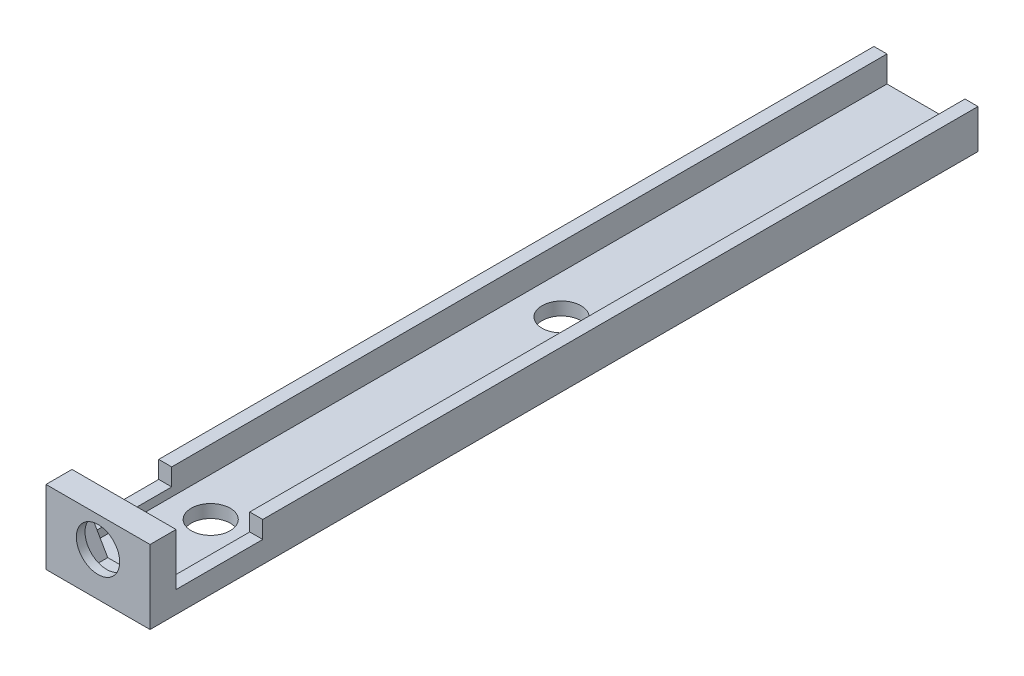
ISO-10303-21;
HEADER;
FILE_DESCRIPTION(('STEP AP214'),'2;1');
FILE_NAME('part.step','',(''),(''),'','','');
FILE_SCHEMA(('AUTOMOTIVE_DESIGN { 1 0 10303 214 1 1 1 1 }'));
ENDSEC;
DATA;
#1=APPLICATION_CONTEXT('core data for automotive mechanical design processes');
#2=APPLICATION_PROTOCOL_DEFINITION('international standard','automotive_design',2000,#1);
#3=PRODUCT_CONTEXT('',#1,'mechanical');
#4=PRODUCT('Part','Part','',(#3));
#5=PRODUCT_RELATED_PRODUCT_CATEGORY('part','',(#4));
#6=PRODUCT_DEFINITION_FORMATION('','',#4);
#7=PRODUCT_DEFINITION_CONTEXT('part definition',#1,'design');
#8=PRODUCT_DEFINITION('design','',#6,#7);
#9=PRODUCT_DEFINITION_SHAPE('','',#8);
#10=(LENGTH_UNIT() NAMED_UNIT(*) SI_UNIT(.MILLI.,.METRE.));
#11=(NAMED_UNIT(*) PLANE_ANGLE_UNIT() SI_UNIT($,.RADIAN.));
#12=(NAMED_UNIT(*) SI_UNIT($,.STERADIAN.) SOLID_ANGLE_UNIT());
#13=UNCERTAINTY_MEASURE_WITH_UNIT(LENGTH_MEASURE(1.E-05),#10,'distance_accuracy_value','');
#14=(GEOMETRIC_REPRESENTATION_CONTEXT(3) GLOBAL_UNCERTAINTY_ASSIGNED_CONTEXT((#13)) GLOBAL_UNIT_ASSIGNED_CONTEXT((#10,
#11,#12)) REPRESENTATION_CONTEXT('',''));
#15=CARTESIAN_POINT('',(0.,0.,0.));
#16=DIRECTION('',(0.,0.,1.));
#17=DIRECTION('',(1.,0.,0.));
#18=AXIS2_PLACEMENT_3D('',#15,#16,#17);
#19=CARTESIAN_POINT('',(21.,2.99999999999999,165.));
#20=DIRECTION('',(1.,0.,0.));
#21=DIRECTION('',(0.,0.,-1.));
#22=AXIS2_PLACEMENT_3D('',#19,#20,#21);
#23=PLANE('',#22);
#24=DIRECTION('',(0.,-1.,0.));
#25=VECTOR('',#24,1.);
#26=CARTESIAN_POINT('',(21.,0.,185.));
#27=LINE('',#26,#25);
#28=CARTESIAN_POINT('',(21.,4.99999999999999,185.));
#29=VERTEX_POINT('',#28);
#30=CARTESIAN_POINT('',(21.,2.99999999999999,185.));
#31=VERTEX_POINT('',#30);
#32=EDGE_CURVE('E254',#29,#31,#27,.T.);
#33=ORIENTED_EDGE('',*,*,#32,.F.);
#34=DIRECTION('',(0.,0.,-1.));
#35=VECTOR('',#34,1.);
#36=CARTESIAN_POINT('',(21.,4.99999999999999,189.));
#37=LINE('',#36,#35);
#38=CARTESIAN_POINT('',(21.,4.99999999999999,165.));
#39=VERTEX_POINT('',#38);
#40=EDGE_CURVE('E301',#29,#39,#37,.T.);
#41=ORIENTED_EDGE('',*,*,#40,.T.);
#42=DIRECTION('',(0.,-1.,0.));
#43=VECTOR('',#42,1.);
#44=CARTESIAN_POINT('',(21.,2.99999999999999,165.));
#45=LINE('',#44,#43);
#46=CARTESIAN_POINT('',(21.,8.99999999999999,165.));
#47=VERTEX_POINT('',#46);
#48=EDGE_CURVE('E310',#47,#39,#45,.T.);
#49=ORIENTED_EDGE('',*,*,#48,.F.);
#50=DIRECTION('',(0.,0.,-1.));
#51=VECTOR('',#50,1.);
#52=CARTESIAN_POINT('',(21.,8.99999999999999,165.));
#53=LINE('',#52,#51);
#54=CARTESIAN_POINT('',(21.,8.99999999999999,0.));
#55=VERTEX_POINT('',#54);
#56=EDGE_CURVE('E342',#47,#55,#53,.T.);
#57=ORIENTED_EDGE('',*,*,#56,.T.);
#58=DIRECTION('',(0.,-1.,0.));
#59=VECTOR('',#58,1.);
#60=CARTESIAN_POINT('',(21.,2.99999999999999,0.));
#61=LINE('',#60,#59);
#62=CARTESIAN_POINT('',(21.,2.99999999999999,0.));
#63=VERTEX_POINT('',#62);
#64=EDGE_CURVE('E323',#55,#63,#61,.T.);
#65=ORIENTED_EDGE('',*,*,#64,.T.);
#66=DIRECTION('',(0.,0.,-1.));
#67=VECTOR('',#66,1.);
#68=CARTESIAN_POINT('',(21.,2.99999999999999,165.));
#69=LINE('',#68,#67);
#70=EDGE_CURVE('E340',#31,#63,#69,.T.);
#71=ORIENTED_EDGE('',*,*,#70,.F.);
#72=EDGE_LOOP('',(#33,#41,#49,#57,#65,#71));
#73=FACE_BOUND('',#72,.T.);
#74=ADVANCED_FACE('F43',(#73),#23,.F.);
#75=CARTESIAN_POINT('',(3.,3.,165.));
#76=DIRECTION('',(0.,-1.,0.));
#77=DIRECTION('',(1.,0.,0.));
#78=AXIS2_PLACEMENT_3D('',#75,#76,#77);
#79=PLANE('',#78);
#80=CARTESIAN_POINT('',(12.,3.,165.));
#81=DIRECTION('',(0.,1.,0.));
#82=DIRECTION('',(-1.,0.,0.));
#83=AXIS2_PLACEMENT_3D('',#80,#81,#82);
#84=CIRCLE('',#83,4.50000000000001);
#85=CARTESIAN_POINT('',(7.49999999999999,3.,165.));
#86=VERTEX_POINT('',#85);
#87=EDGE_CURVE('E424',#86,#86,#84,.T.);
#88=ORIENTED_EDGE('',*,*,#87,.F.);
#89=EDGE_LOOP('',(#88));
#90=FACE_BOUND('',#89,.T.);
#91=CARTESIAN_POINT('',(12.,3.,84.075));
#92=DIRECTION('',(0.,1.,0.));
#93=DIRECTION('',(-1.,0.,0.));
#94=AXIS2_PLACEMENT_3D('',#91,#92,#93);
#95=CIRCLE('',#94,4.5);
#96=CARTESIAN_POINT('',(7.5,3.,84.075));
#97=VERTEX_POINT('',#96);
#98=EDGE_CURVE('E422',#97,#97,#95,.T.);
#99=ORIENTED_EDGE('',*,*,#98,.F.);
#100=EDGE_LOOP('',(#99));
#101=FACE_BOUND('',#100,.T.);
#102=DIRECTION('',(-1.,0.,0.));
#103=VECTOR('',#102,1.);
#104=CARTESIAN_POINT('',(0.,3.,185.));
#105=LINE('',#104,#103);
#106=CARTESIAN_POINT('',(3.,3.,185.));
#107=VERTEX_POINT('',#106);
#108=EDGE_CURVE('E252',#31,#107,#105,.T.);
#109=ORIENTED_EDGE('',*,*,#108,.F.);
#110=ORIENTED_EDGE('',*,*,#70,.T.);
#111=DIRECTION('',(-1.,0.,0.));
#112=VECTOR('',#111,1.);
#113=CARTESIAN_POINT('',(3.,3.,0.));
#114=LINE('',#113,#112);
#115=CARTESIAN_POINT('',(3.,3.,0.));
#116=VERTEX_POINT('',#115);
#117=EDGE_CURVE('E326',#63,#116,#114,.T.);
#118=ORIENTED_EDGE('',*,*,#117,.T.);
#119=DIRECTION('',(0.,0.,-1.));
#120=VECTOR('',#119,1.);
#121=CARTESIAN_POINT('',(3.,3.,165.));
#122=LINE('',#121,#120);
#123=EDGE_CURVE('E338',#107,#116,#122,.T.);
#124=ORIENTED_EDGE('',*,*,#123,.F.);
#125=EDGE_LOOP('',(#109,#110,#118,#124));
#126=FACE_BOUND('',#125,.T.);
#127=ADVANCED_FACE('F400',(#90,#101,#126),#79,.F.);
#128=CARTESIAN_POINT('',(3.,9.,165.));
#129=DIRECTION('',(-1.,0.,0.));
#130=DIRECTION('',(0.,-1.,0.));
#131=AXIS2_PLACEMENT_3D('',#128,#129,#130);
#132=PLANE('',#131);
#133=DIRECTION('',(0.,1.,0.));
#134=VECTOR('',#133,1.);
#135=CARTESIAN_POINT('',(3.,0.,185.));
#136=LINE('',#135,#134);
#137=CARTESIAN_POINT('',(3.,4.99999999999999,185.));
#138=VERTEX_POINT('',#137);
#139=EDGE_CURVE('E250',#107,#138,#136,.T.);
#140=ORIENTED_EDGE('',*,*,#139,.F.);
#141=ORIENTED_EDGE('',*,*,#123,.T.);
#142=DIRECTION('',(0.,1.,0.));
#143=VECTOR('',#142,1.);
#144=CARTESIAN_POINT('',(3.,9.,0.));
#145=LINE('',#144,#143);
#146=CARTESIAN_POINT('',(3.,9.,0.));
#147=VERTEX_POINT('',#146);
#148=EDGE_CURVE('E329',#116,#147,#145,.T.);
#149=ORIENTED_EDGE('',*,*,#148,.T.);
#150=DIRECTION('',(0.,0.,-1.));
#151=VECTOR('',#150,1.);
#152=CARTESIAN_POINT('',(3.,9.,165.));
#153=LINE('',#152,#151);
#154=CARTESIAN_POINT('',(3.,9.,165.));
#155=VERTEX_POINT('',#154);
#156=EDGE_CURVE('E335',#155,#147,#153,.T.);
#157=ORIENTED_EDGE('',*,*,#156,.F.);
#158=DIRECTION('',(0.,1.,0.));
#159=VECTOR('',#158,1.);
#160=CARTESIAN_POINT('',(3.,9.,165.));
#161=LINE('',#160,#159);
#162=CARTESIAN_POINT('',(3.,4.99999999999999,165.));
#163=VERTEX_POINT('',#162);
#164=EDGE_CURVE('E313',#163,#155,#161,.T.);
#165=ORIENTED_EDGE('',*,*,#164,.F.);
#166=DIRECTION('',(0.,0.,-1.));
#167=VECTOR('',#166,1.);
#168=CARTESIAN_POINT('',(3.,4.99999999999999,189.));
#169=LINE('',#168,#167);
#170=EDGE_CURVE('E66',#138,#163,#169,.T.);
#171=ORIENTED_EDGE('',*,*,#170,.F.);
#172=EDGE_LOOP('',(#140,#141,#149,#157,#165,#171));
#173=FACE_BOUND('',#172,.T.);
#174=ADVANCED_FACE('F384',(#173),#132,.F.);
#175=CARTESIAN_POINT('',(24.,4.99999999999999,189.));
#176=DIRECTION('',(0.,-1.,0.));
#177=DIRECTION('',(0.,0.,-1.));
#178=AXIS2_PLACEMENT_3D('',#175,#176,#177);
#179=PLANE('',#178);
#180=DIRECTION('',(-1.,0.,0.));
#181=VECTOR('',#180,1.);
#182=CARTESIAN_POINT('',(0.,4.99999999999999,185.));
#183=LINE('',#182,#181);
#184=CARTESIAN_POINT('',(24.,4.99999999999999,185.));
#185=VERTEX_POINT('',#184);
#186=EDGE_CURVE('E239',#185,#29,#183,.T.);
#187=ORIENTED_EDGE('',*,*,#186,.F.);
#188=DIRECTION('',(0.,0.,-1.));
#189=VECTOR('',#188,1.);
#190=CARTESIAN_POINT('',(24.,4.99999999999999,189.));
#191=LINE('',#190,#189);
#192=CARTESIAN_POINT('',(24.,4.99999999999999,165.));
#193=VERTEX_POINT('',#192);
#194=EDGE_CURVE('E303',#185,#193,#191,.T.);
#195=ORIENTED_EDGE('',*,*,#194,.T.);
#196=DIRECTION('',(-1.,0.,0.));
#197=VECTOR('',#196,1.);
#198=CARTESIAN_POINT('',(24.,4.99999999999999,165.));
#199=LINE('',#198,#197);
#200=EDGE_CURVE('E275',#193,#39,#199,.T.);
#201=ORIENTED_EDGE('',*,*,#200,.T.);
#202=ORIENTED_EDGE('',*,*,#40,.F.);
#203=EDGE_LOOP('',(#187,#195,#201,#202));
#204=FACE_BOUND('',#203,.T.);
#205=ADVANCED_FACE('F368',(#204),#179,.F.);
#206=CARTESIAN_POINT('',(3.,4.99999999999999,189.));
#207=DIRECTION('',(0.,-1.,0.));
#208=DIRECTION('',(0.,0.,-1.));
#209=AXIS2_PLACEMENT_3D('',#206,#207,#208);
#210=PLANE('',#209);
#211=DIRECTION('',(-1.,0.,0.));
#212=VECTOR('',#211,1.);
#213=CARTESIAN_POINT('',(0.,4.99999999999999,185.));
#214=LINE('',#213,#212);
#215=CARTESIAN_POINT('',(0.,4.99999999999999,185.));
#216=VERTEX_POINT('',#215);
#217=EDGE_CURVE('E248',#138,#216,#214,.T.);
#218=ORIENTED_EDGE('',*,*,#217,.F.);
#219=ORIENTED_EDGE('',*,*,#170,.T.);
#220=DIRECTION('',(-1.,0.,0.));
#221=VECTOR('',#220,1.);
#222=CARTESIAN_POINT('',(3.,4.99999999999999,165.));
#223=LINE('',#222,#221);
#224=CARTESIAN_POINT('',(0.,4.99999999999999,165.));
#225=VERTEX_POINT('',#224);
#226=EDGE_CURVE('E297',#163,#225,#223,.T.);
#227=ORIENTED_EDGE('',*,*,#226,.T.);
#228=DIRECTION('',(0.,0.,-1.));
#229=VECTOR('',#228,1.);
#230=CARTESIAN_POINT('',(0.,4.99999999999999,189.));
#231=LINE('',#230,#229);
#232=EDGE_CURVE('E58',#216,#225,#231,.T.);
#233=ORIENTED_EDGE('',*,*,#232,.F.);
#234=EDGE_LOOP('',(#218,#219,#227,#233));
#235=FACE_BOUND('',#234,.T.);
#236=ADVANCED_FACE('F377',(#235),#210,.F.);
#237=CARTESIAN_POINT('',(0.,0.,165.));
#238=DIRECTION('',(0.,0.,-1.));
#239=DIRECTION('',(-1.,0.,0.));
#240=AXIS2_PLACEMENT_3D('',#237,#238,#239);
#241=PLANE('',#240);
#242=ORIENTED_EDGE('',*,*,#226,.F.);
#243=ORIENTED_EDGE('',*,*,#164,.T.);
#244=DIRECTION('',(-1.,0.,0.));
#245=VECTOR('',#244,1.);
#246=CARTESIAN_POINT('',(0.,9.,165.));
#247=LINE('',#246,#245);
#248=CARTESIAN_POINT('',(0.,9.,165.));
#249=VERTEX_POINT('',#248);
#250=EDGE_CURVE('E315',#155,#249,#247,.T.);
#251=ORIENTED_EDGE('',*,*,#250,.T.);
#252=DIRECTION('',(0.,-1.,0.));
#253=VECTOR('',#252,1.);
#254=CARTESIAN_POINT('',(0.,0.,165.));
#255=LINE('',#254,#253);
#256=EDGE_CURVE('E197',#249,#225,#255,.T.);
#257=ORIENTED_EDGE('',*,*,#256,.T.);
#258=EDGE_LOOP('',(#242,#243,#251,#257));
#259=FACE_BOUND('',#258,.T.);
#260=ADVANCED_FACE('F380',(#259),#241,.F.);
#261=ORIENTED_EDGE('',*,*,#200,.F.);
#262=DIRECTION('',(0.,1.,0.));
#263=VECTOR('',#262,1.);
#264=CARTESIAN_POINT('',(24.,8.99999999999999,165.));
#265=LINE('',#264,#263);
#266=CARTESIAN_POINT('',(24.,8.99999999999999,165.));
#267=VERTEX_POINT('',#266);
#268=EDGE_CURVE('E306',#193,#267,#265,.T.);
#269=ORIENTED_EDGE('',*,*,#268,.T.);
#270=DIRECTION('',(-1.,0.,0.));
#271=VECTOR('',#270,1.);
#272=CARTESIAN_POINT('',(21.,8.99999999999999,165.));
#273=LINE('',#272,#271);
#274=EDGE_CURVE('E308',#267,#47,#273,.T.);
#275=ORIENTED_EDGE('',*,*,#274,.T.);
#276=ORIENTED_EDGE('',*,*,#48,.T.);
#277=EDGE_LOOP('',(#261,#269,#275,#276));
#278=FACE_BOUND('',#277,.T.);
#279=ADVANCED_FACE('F365',(#278),#241,.F.);
#280=CARTESIAN_POINT('',(24.,0.,165.));
#281=DIRECTION('',(0.,1.,0.));
#282=DIRECTION('',(-1.,0.,0.));
#283=AXIS2_PLACEMENT_3D('',#280,#281,#282);
#284=PLANE('',#283);
#285=CARTESIAN_POINT('',(12.,0.,165.));
#286=DIRECTION('',(0.,1.,0.));
#287=DIRECTION('',(-1.,0.,0.));
#288=AXIS2_PLACEMENT_3D('',#285,#286,#287);
#289=CIRCLE('',#288,4.50000000000001);
#290=CARTESIAN_POINT('',(7.49999999999999,0.,165.));
#291=VERTEX_POINT('',#290);
#292=EDGE_CURVE('E213',#291,#291,#289,.T.);
#293=ORIENTED_EDGE('',*,*,#292,.T.);
#294=EDGE_LOOP('',(#293));
#295=FACE_BOUND('',#294,.T.);
#296=CARTESIAN_POINT('',(12.,0.,84.075));
#297=DIRECTION('',(0.,1.,0.));
#298=DIRECTION('',(-1.,0.,0.));
#299=AXIS2_PLACEMENT_3D('',#296,#297,#298);
#300=CIRCLE('',#299,4.5);
#301=CARTESIAN_POINT('',(7.5,0.,84.075));
#302=VERTEX_POINT('',#301);
#303=EDGE_CURVE('E216',#302,#302,#300,.T.);
#304=ORIENTED_EDGE('',*,*,#303,.T.);
#305=EDGE_LOOP('',(#304));
#306=FACE_BOUND('',#305,.T.);
#307=DIRECTION('',(1.,0.,0.));
#308=VECTOR('',#307,1.);
#309=CARTESIAN_POINT('',(24.,0.,0.));
#310=LINE('',#309,#308);
#311=CARTESIAN_POINT('',(0.,0.,0.));
#312=VERTEX_POINT('',#311);
#313=CARTESIAN_POINT('',(24.,0.,0.));
#314=VERTEX_POINT('',#313);
#315=EDGE_CURVE('E305',#312,#314,#310,.T.);
#316=ORIENTED_EDGE('',*,*,#315,.T.);
#317=DIRECTION('',(0.,0.,-1.));
#318=VECTOR('',#317,1.);
#319=CARTESIAN_POINT('',(24.,0.,165.));
#320=LINE('',#319,#318);
#321=CARTESIAN_POINT('',(24.,0.,191.));
#322=VERTEX_POINT('',#321);
#323=EDGE_CURVE('E11',#322,#314,#320,.T.);
#324=ORIENTED_EDGE('',*,*,#323,.F.);
#325=DIRECTION('',(1.,0.,0.));
#326=VECTOR('',#325,1.);
#327=CARTESIAN_POINT('',(0.,0.,191.));
#328=LINE('',#327,#326);
#329=CARTESIAN_POINT('',(0.,0.,191.));
#330=VERTEX_POINT('',#329);
#331=EDGE_CURVE('E200',#330,#322,#328,.T.);
#332=ORIENTED_EDGE('',*,*,#331,.F.);
#333=DIRECTION('',(0.,0.,-1.));
#334=VECTOR('',#333,1.);
#335=CARTESIAN_POINT('',(0.,0.,165.));
#336=LINE('',#335,#334);
#337=EDGE_CURVE('E183',#330,#312,#336,.T.);
#338=ORIENTED_EDGE('',*,*,#337,.T.);
#339=EDGE_LOOP('',(#316,#324,#332,#338));
#340=FACE_BOUND('',#339,.T.);
#341=ADVANCED_FACE('F45',(#295,#306,#340),#284,.F.);
#342=CARTESIAN_POINT('',(24.,8.99999999999999,165.));
#343=DIRECTION('',(-1.,0.,0.));
#344=DIRECTION('',(0.,0.,1.));
#345=AXIS2_PLACEMENT_3D('',#342,#343,#344);
#346=PLANE('',#345);
#347=DIRECTION('',(0.,1.,0.));
#348=VECTOR('',#347,1.);
#349=CARTESIAN_POINT('',(24.,8.99999999999999,0.));
#350=LINE('',#349,#348);
#351=CARTESIAN_POINT('',(24.,8.99999999999999,0.));
#352=VERTEX_POINT('',#351);
#353=EDGE_CURVE('E319',#314,#352,#350,.T.);
#354=ORIENTED_EDGE('',*,*,#353,.T.);
#355=DIRECTION('',(0.,0.,-1.));
#356=VECTOR('',#355,1.);
#357=CARTESIAN_POINT('',(24.,8.99999999999999,165.));
#358=LINE('',#357,#356);
#359=EDGE_CURVE('E51',#267,#352,#358,.T.);
#360=ORIENTED_EDGE('',*,*,#359,.F.);
#361=ORIENTED_EDGE('',*,*,#268,.F.);
#362=ORIENTED_EDGE('',*,*,#194,.F.);
#363=DIRECTION('',(0.,1.,0.));
#364=VECTOR('',#363,1.);
#365=CARTESIAN_POINT('',(24.,0.,185.));
#366=LINE('',#365,#364);
#367=CARTESIAN_POINT('',(24.,17.,185.));
#368=VERTEX_POINT('',#367);
#369=EDGE_CURVE('E241',#185,#368,#366,.T.);
#370=ORIENTED_EDGE('',*,*,#369,.T.);
#371=DIRECTION('',(0.,0.,1.));
#372=VECTOR('',#371,1.);
#373=CARTESIAN_POINT('',(24.,17.,185.));
#374=LINE('',#373,#372);
#375=CARTESIAN_POINT('',(24.,17.,191.));
#376=VERTEX_POINT('',#375);
#377=EDGE_CURVE('E276',#368,#376,#374,.T.);
#378=ORIENTED_EDGE('',*,*,#377,.T.);
#379=DIRECTION('',(0.,1.,0.));
#380=VECTOR('',#379,1.);
#381=CARTESIAN_POINT('',(24.,0.,191.));
#382=LINE('',#381,#380);
#383=EDGE_CURVE('E204',#322,#376,#382,.T.);
#384=ORIENTED_EDGE('',*,*,#383,.F.);
#385=ORIENTED_EDGE('',*,*,#323,.T.);
#386=EDGE_LOOP('',(#354,#360,#361,#362,#370,#378,#384,#385));
#387=FACE_BOUND('',#386,.T.);
#388=ADVANCED_FACE('F370',(#387),#346,.F.);
#389=CARTESIAN_POINT('',(21.,8.99999999999999,165.));
#390=DIRECTION('',(0.,-1.,0.));
#391=DIRECTION('',(0.,0.,-1.));
#392=AXIS2_PLACEMENT_3D('',#389,#390,#391);
#393=PLANE('',#392);
#394=DIRECTION('',(-1.,0.,0.));
#395=VECTOR('',#394,1.);
#396=CARTESIAN_POINT('',(21.,8.99999999999999,0.));
#397=LINE('',#396,#395);
#398=EDGE_CURVE('E321',#352,#55,#397,.T.);
#399=ORIENTED_EDGE('',*,*,#398,.T.);
#400=ORIENTED_EDGE('',*,*,#56,.F.);
#401=ORIENTED_EDGE('',*,*,#274,.F.);
#402=ORIENTED_EDGE('',*,*,#359,.T.);
#403=EDGE_LOOP('',(#399,#400,#401,#402));
#404=FACE_BOUND('',#403,.T.);
#405=ADVANCED_FACE('F349',(#404),#393,.F.);
#406=CARTESIAN_POINT('',(0.,9.,165.));
#407=DIRECTION('',(0.,-1.,0.));
#408=DIRECTION('',(1.,0.,0.));
#409=AXIS2_PLACEMENT_3D('',#406,#407,#408);
#410=PLANE('',#409);
#411=DIRECTION('',(-1.,0.,0.));
#412=VECTOR('',#411,1.);
#413=CARTESIAN_POINT('',(0.,9.,0.));
#414=LINE('',#413,#412);
#415=CARTESIAN_POINT('',(0.,9.,0.));
#416=VERTEX_POINT('',#415);
#417=EDGE_CURVE('E331',#147,#416,#414,.T.);
#418=ORIENTED_EDGE('',*,*,#417,.T.);
#419=DIRECTION('',(0.,0.,-1.));
#420=VECTOR('',#419,1.);
#421=CARTESIAN_POINT('',(0.,9.,165.));
#422=LINE('',#421,#420);
#423=EDGE_CURVE('E196',#249,#416,#422,.T.);
#424=ORIENTED_EDGE('',*,*,#423,.F.);
#425=ORIENTED_EDGE('',*,*,#250,.F.);
#426=ORIENTED_EDGE('',*,*,#156,.T.);
#427=EDGE_LOOP('',(#418,#424,#425,#426));
#428=FACE_BOUND('',#427,.T.);
#429=ADVANCED_FACE('F389',(#428),#410,.F.);
#430=CARTESIAN_POINT('',(0.,0.,165.));
#431=DIRECTION('',(1.,0.,0.));
#432=DIRECTION('',(0.,1.,0.));
#433=AXIS2_PLACEMENT_3D('',#430,#431,#432);
#434=PLANE('',#433);
#435=DIRECTION('',(0.,-1.,0.));
#436=VECTOR('',#435,1.);
#437=CARTESIAN_POINT('',(0.,0.,0.));
#438=LINE('',#437,#436);
#439=EDGE_CURVE('E192',#416,#312,#438,.T.);
#440=ORIENTED_EDGE('',*,*,#439,.T.);
#441=ORIENTED_EDGE('',*,*,#337,.F.);
#442=DIRECTION('',(0.,1.,0.));
#443=VECTOR('',#442,1.);
#444=CARTESIAN_POINT('',(0.,0.,191.));
#445=LINE('',#444,#443);
#446=CARTESIAN_POINT('',(0.,17.,191.));
#447=VERTEX_POINT('',#446);
#448=EDGE_CURVE('E188',#330,#447,#445,.T.);
#449=ORIENTED_EDGE('',*,*,#448,.T.);
#450=DIRECTION('',(0.,0.,1.));
#451=VECTOR('',#450,1.);
#452=CARTESIAN_POINT('',(0.,17.,185.));
#453=LINE('',#452,#451);
#454=CARTESIAN_POINT('',(0.,17.,185.));
#455=VERTEX_POINT('',#454);
#456=EDGE_CURVE('E273',#455,#447,#453,.T.);
#457=ORIENTED_EDGE('',*,*,#456,.F.);
#458=DIRECTION('',(0.,1.,0.));
#459=VECTOR('',#458,1.);
#460=CARTESIAN_POINT('',(0.,0.,185.));
#461=LINE('',#460,#459);
#462=EDGE_CURVE('E246',#216,#455,#461,.T.);
#463=ORIENTED_EDGE('',*,*,#462,.F.);
#464=ORIENTED_EDGE('',*,*,#232,.T.);
#465=ORIENTED_EDGE('',*,*,#256,.F.);
#466=ORIENTED_EDGE('',*,*,#423,.T.);
#467=EDGE_LOOP('',(#440,#441,#449,#457,#463,#464,#465,#466));
#468=FACE_BOUND('',#467,.T.);
#469=ADVANCED_FACE('F185',(#468),#434,.F.);
#470=CARTESIAN_POINT('',(0.,0.,0.));
#471=DIRECTION('',(0.,0.,-1.));
#472=DIRECTION('',(-1.,0.,0.));
#473=AXIS2_PLACEMENT_3D('',#470,#471,#472);
#474=PLANE('',#473);
#475=ORIENTED_EDGE('',*,*,#315,.F.);
#476=ORIENTED_EDGE('',*,*,#439,.F.);
#477=ORIENTED_EDGE('',*,*,#417,.F.);
#478=ORIENTED_EDGE('',*,*,#148,.F.);
#479=ORIENTED_EDGE('',*,*,#117,.F.);
#480=ORIENTED_EDGE('',*,*,#64,.F.);
#481=ORIENTED_EDGE('',*,*,#398,.F.);
#482=ORIENTED_EDGE('',*,*,#353,.F.);
#483=EDGE_LOOP('',(#475,#476,#477,#478,#479,#480,#481,#482));
#484=FACE_BOUND('',#483,.T.);
#485=ADVANCED_FACE('F355',(#484),#474,.T.);
#486=CARTESIAN_POINT('',(0.,17.,185.));
#487=DIRECTION('',(0.,-1.,0.));
#488=DIRECTION('',(0.,0.,-1.));
#489=AXIS2_PLACEMENT_3D('',#486,#487,#488);
#490=PLANE('',#489);
#491=ORIENTED_EDGE('',*,*,#456,.T.);
#492=DIRECTION('',(1.,0.,0.));
#493=VECTOR('',#492,1.);
#494=CARTESIAN_POINT('',(0.,17.,191.));
#495=LINE('',#494,#493);
#496=EDGE_CURVE('E209',#447,#376,#495,.T.);
#497=ORIENTED_EDGE('',*,*,#496,.T.);
#498=ORIENTED_EDGE('',*,*,#377,.F.);
#499=DIRECTION('',(1.,0.,0.));
#500=VECTOR('',#499,1.);
#501=CARTESIAN_POINT('',(0.,17.,185.));
#502=LINE('',#501,#500);
#503=EDGE_CURVE('E244',#455,#368,#502,.T.);
#504=ORIENTED_EDGE('',*,*,#503,.F.);
#505=EDGE_LOOP('',(#491,#497,#498,#504));
#506=FACE_BOUND('',#505,.T.);
#507=ADVANCED_FACE('F376',(#506),#490,.F.);
#508=CARTESIAN_POINT('',(18.959292143521,10.9461524227066,185.));
#509=DIRECTION('',(0.866025403784439,0.5,0.));
#510=DIRECTION('',(-0.5,0.866025403784439,0.));
#511=AXIS2_PLACEMENT_3D('',#508,#509,#510);
#512=PLANE('',#511);
#513=DIRECTION('',(-0.5,0.866025403784439,0.));
#514=VECTOR('',#513,1.);
#515=CARTESIAN_POINT('',(18.959292143521,10.9461524227066,189.));
#516=LINE('',#515,#514);
#517=CARTESIAN_POINT('',(19.5055534994651,9.99999999999998,189.));
#518=VERTEX_POINT('',#517);
#519=CARTESIAN_POINT('',(15.7527767497326,16.5,189.));
#520=VERTEX_POINT('',#519);
#521=EDGE_CURVE('E223',#518,#520,#516,.T.);
#522=ORIENTED_EDGE('',*,*,#521,.T.);
#523=DIRECTION('',(0.,0.,1.));
#524=VECTOR('',#523,1.);
#525=CARTESIAN_POINT('',(15.7527767497326,16.5,185.));
#526=LINE('',#525,#524);
#527=CARTESIAN_POINT('',(15.7527767497326,16.5,185.));
#528=VERTEX_POINT('',#527);
#529=EDGE_CURVE('E278',#528,#520,#526,.T.);
#530=ORIENTED_EDGE('',*,*,#529,.F.);
#531=DIRECTION('',(-0.5,0.866025403784439,0.));
#532=VECTOR('',#531,1.);
#533=CARTESIAN_POINT('',(18.959292143521,10.9461524227066,185.));
#534=LINE('',#533,#532);
#535=CARTESIAN_POINT('',(19.5055534994651,9.99999999999998,185.));
#536=VERTEX_POINT('',#535);
#537=EDGE_CURVE('E225',#536,#528,#534,.T.);
#538=ORIENTED_EDGE('',*,*,#537,.F.);
#539=DIRECTION('',(0.,0.,1.));
#540=VECTOR('',#539,1.);
#541=CARTESIAN_POINT('',(19.5055534994651,9.99999999999998,185.));
#542=LINE('',#541,#540);
#543=EDGE_CURVE('E256',#536,#518,#542,.T.);
#544=ORIENTED_EDGE('',*,*,#543,.T.);
#545=EDGE_LOOP('',(#522,#530,#538,#544));
#546=FACE_BOUND('',#545,.T.);
#547=ADVANCED_FACE('F462',(#546),#512,.F.);
#548=CARTESIAN_POINT('',(0.,16.5,185.));
#549=DIRECTION('',(0.,1.,0.));
#550=DIRECTION('',(0.,0.,1.));
#551=AXIS2_PLACEMENT_3D('',#548,#549,#550);
#552=PLANE('',#551);
#553=DIRECTION('',(-1.,0.,0.));
#554=VECTOR('',#553,1.);
#555=CARTESIAN_POINT('',(0.,16.5,189.));
#556=LINE('',#555,#554);
#557=CARTESIAN_POINT('',(8.24722325026743,16.5,189.));
#558=VERTEX_POINT('',#557);
#559=EDGE_CURVE('E229',#520,#558,#556,.T.);
#560=ORIENTED_EDGE('',*,*,#559,.T.);
#561=DIRECTION('',(0.,0.,1.));
#562=VECTOR('',#561,1.);
#563=CARTESIAN_POINT('',(8.24722325026743,16.5,185.));
#564=LINE('',#563,#562);
#565=CARTESIAN_POINT('',(8.24722325026743,16.5,185.));
#566=VERTEX_POINT('',#565);
#567=EDGE_CURVE('E281',#566,#558,#564,.T.);
#568=ORIENTED_EDGE('',*,*,#567,.F.);
#569=DIRECTION('',(-1.,0.,0.));
#570=VECTOR('',#569,1.);
#571=CARTESIAN_POINT('',(0.,16.5,185.));
#572=LINE('',#571,#570);
#573=EDGE_CURVE('E237',#528,#566,#572,.T.);
#574=ORIENTED_EDGE('',*,*,#573,.F.);
#575=ORIENTED_EDGE('',*,*,#529,.T.);
#576=EDGE_LOOP('',(#560,#568,#574,#575));
#577=FACE_BOUND('',#576,.T.);
#578=ADVANCED_FACE('F463',(#577),#552,.F.);
#579=CARTESIAN_POINT('',(-0.959292143521044,0.553847577293368,185.));
#580=DIRECTION('',(-0.866025403784439,0.5,0.));
#581=DIRECTION('',(-0.5,-0.866025403784439,0.));
#582=AXIS2_PLACEMENT_3D('',#579,#580,#581);
#583=PLANE('',#582);
#584=DIRECTION('',(-0.5,-0.866025403784439,0.));
#585=VECTOR('',#584,1.);
#586=CARTESIAN_POINT('',(-0.959292143521044,0.553847577293368,189.));
#587=LINE('',#586,#585);
#588=CARTESIAN_POINT('',(4.49444650053486,10.,189.));
#589=VERTEX_POINT('',#588);
#590=EDGE_CURVE('E268',#558,#589,#587,.T.);
#591=ORIENTED_EDGE('',*,*,#590,.T.);
#592=DIRECTION('',(0.,0.,1.));
#593=VECTOR('',#592,1.);
#594=CARTESIAN_POINT('',(4.49444650053486,10.,185.));
#595=LINE('',#594,#593);
#596=CARTESIAN_POINT('',(4.49444650053486,10.,185.));
#597=VERTEX_POINT('',#596);
#598=EDGE_CURVE('E284',#597,#589,#595,.T.);
#599=ORIENTED_EDGE('',*,*,#598,.F.);
#600=DIRECTION('',(-0.5,-0.866025403784439,0.));
#601=VECTOR('',#600,1.);
#602=CARTESIAN_POINT('',(-0.959292143521044,0.553847577293368,185.));
#603=LINE('',#602,#601);
#604=EDGE_CURVE('E235',#566,#597,#603,.T.);
#605=ORIENTED_EDGE('',*,*,#604,.F.);
#606=ORIENTED_EDGE('',*,*,#567,.T.);
#607=EDGE_LOOP('',(#591,#599,#605,#606));
#608=FACE_BOUND('',#607,.T.);
#609=ADVANCED_FACE('F466',(#608),#583,.F.);
#610=CARTESIAN_POINT('',(7.70096189432334,4.44615242270663,185.));
#611=DIRECTION('',(-0.866025403784439,-0.5,0.));
#612=DIRECTION('',(0.5,-0.866025403784439,0.));
#613=AXIS2_PLACEMENT_3D('',#610,#611,#612);
#614=PLANE('',#613);
#615=DIRECTION('',(0.5,-0.866025403784439,0.));
#616=VECTOR('',#615,1.);
#617=CARTESIAN_POINT('',(7.70096189432334,4.44615242270663,189.));
#618=LINE('',#617,#616);
#619=CARTESIAN_POINT('',(8.24722325026743,3.5,189.));
#620=VERTEX_POINT('',#619);
#621=EDGE_CURVE('E265',#589,#620,#618,.T.);
#622=ORIENTED_EDGE('',*,*,#621,.T.);
#623=DIRECTION('',(0.,0.,1.));
#624=VECTOR('',#623,1.);
#625=CARTESIAN_POINT('',(8.24722325026743,3.5,185.));
#626=LINE('',#625,#624);
#627=CARTESIAN_POINT('',(8.24722325026743,3.5,185.));
#628=VERTEX_POINT('',#627);
#629=EDGE_CURVE('E287',#628,#620,#626,.T.);
#630=ORIENTED_EDGE('',*,*,#629,.F.);
#631=DIRECTION('',(0.5,-0.866025403784439,0.));
#632=VECTOR('',#631,1.);
#633=CARTESIAN_POINT('',(7.70096189432334,4.44615242270663,185.));
#634=LINE('',#633,#632);
#635=EDGE_CURVE('E233',#597,#628,#634,.T.);
#636=ORIENTED_EDGE('',*,*,#635,.F.);
#637=ORIENTED_EDGE('',*,*,#598,.T.);
#638=EDGE_LOOP('',(#622,#630,#636,#637));
#639=FACE_BOUND('',#638,.T.);
#640=ADVANCED_FACE('F470',(#639),#614,.F.);
#641=CARTESIAN_POINT('',(0.,3.5,185.));
#642=DIRECTION('',(0.,-1.,0.));
#643=DIRECTION('',(0.,0.,-1.));
#644=AXIS2_PLACEMENT_3D('',#641,#642,#643);
#645=PLANE('',#644);
#646=DIRECTION('',(1.,0.,0.));
#647=VECTOR('',#646,1.);
#648=CARTESIAN_POINT('',(0.,3.5,189.));
#649=LINE('',#648,#647);
#650=CARTESIAN_POINT('',(15.7527767497326,3.5,189.));
#651=VERTEX_POINT('',#650);
#652=EDGE_CURVE('E262',#620,#651,#649,.T.);
#653=ORIENTED_EDGE('',*,*,#652,.T.);
#654=DIRECTION('',(0.,0.,1.));
#655=VECTOR('',#654,1.);
#656=CARTESIAN_POINT('',(15.7527767497326,3.5,185.));
#657=LINE('',#656,#655);
#658=CARTESIAN_POINT('',(15.7527767497326,3.5,185.));
#659=VERTEX_POINT('',#658);
#660=EDGE_CURVE('E290',#659,#651,#657,.T.);
#661=ORIENTED_EDGE('',*,*,#660,.F.);
#662=DIRECTION('',(1.,0.,0.));
#663=VECTOR('',#662,1.);
#664=CARTESIAN_POINT('',(0.,3.5,185.));
#665=LINE('',#664,#663);
#666=EDGE_CURVE('E231',#628,#659,#665,.T.);
#667=ORIENTED_EDGE('',*,*,#666,.F.);
#668=ORIENTED_EDGE('',*,*,#629,.T.);
#669=EDGE_LOOP('',(#653,#661,#667,#668));
#670=FACE_BOUND('',#669,.T.);
#671=ADVANCED_FACE('F474',(#670),#645,.F.);
#672=CARTESIAN_POINT('',(10.2990381056767,-5.94615242270664,185.));
#673=DIRECTION('',(0.866025403784439,-0.5,0.));
#674=DIRECTION('',(0.5,0.866025403784439,0.));
#675=AXIS2_PLACEMENT_3D('',#672,#673,#674);
#676=PLANE('',#675);
#677=DIRECTION('',(0.5,0.866025403784439,0.));
#678=VECTOR('',#677,1.);
#679=CARTESIAN_POINT('',(10.2990381056767,-5.94615242270664,189.));
#680=LINE('',#679,#678);
#681=EDGE_CURVE('E259',#651,#518,#680,.T.);
#682=ORIENTED_EDGE('',*,*,#681,.T.);
#683=ORIENTED_EDGE('',*,*,#543,.F.);
#684=DIRECTION('',(0.5,0.866025403784439,0.));
#685=VECTOR('',#684,1.);
#686=CARTESIAN_POINT('',(10.2990381056767,-5.94615242270664,185.));
#687=LINE('',#686,#685);
#688=EDGE_CURVE('E228',#659,#536,#687,.T.);
#689=ORIENTED_EDGE('',*,*,#688,.F.);
#690=ORIENTED_EDGE('',*,*,#660,.T.);
#691=EDGE_LOOP('',(#682,#683,#689,#690));
#692=FACE_BOUND('',#691,.T.);
#693=ADVANCED_FACE('F458',(#692),#676,.F.);
#694=CARTESIAN_POINT('',(0.,0.,185.));
#695=DIRECTION('',(0.,0.,1.));
#696=DIRECTION('',(1.,0.,0.));
#697=AXIS2_PLACEMENT_3D('',#694,#695,#696);
#698=PLANE('',#697);
#699=ORIENTED_EDGE('',*,*,#537,.T.);
#700=ORIENTED_EDGE('',*,*,#573,.T.);
#701=ORIENTED_EDGE('',*,*,#604,.T.);
#702=ORIENTED_EDGE('',*,*,#635,.T.);
#703=ORIENTED_EDGE('',*,*,#666,.T.);
#704=ORIENTED_EDGE('',*,*,#688,.T.);
#705=EDGE_LOOP('',(#699,#700,#701,#702,#703,#704));
#706=FACE_BOUND('',#705,.T.);
#707=ORIENTED_EDGE('',*,*,#186,.T.);
#708=ORIENTED_EDGE('',*,*,#32,.T.);
#709=ORIENTED_EDGE('',*,*,#108,.T.);
#710=ORIENTED_EDGE('',*,*,#139,.T.);
#711=ORIENTED_EDGE('',*,*,#217,.T.);
#712=ORIENTED_EDGE('',*,*,#462,.T.);
#713=ORIENTED_EDGE('',*,*,#503,.T.);
#714=ORIENTED_EDGE('',*,*,#369,.F.);
#715=EDGE_LOOP('',(#707,#708,#709,#710,#711,#712,#713,#714));
#716=FACE_BOUND('',#715,.T.);
#717=ADVANCED_FACE('F373',(#706,#716),#698,.F.);
#718=CARTESIAN_POINT('',(12.,10.,191.));
#719=DIRECTION('',(0.,0.,-1.));
#720=DIRECTION('',(-1.,0.,0.));
#721=AXIS2_PLACEMENT_3D('',#718,#719,#720);
#722=CYLINDRICAL_SURFACE('',#721,5.);
#723=CARTESIAN_POINT('',(12.,10.,191.));
#724=DIRECTION('',(0.,0.,1.));
#725=DIRECTION('',(1.,0.,0.));
#726=AXIS2_PLACEMENT_3D('',#723,#724,#725);
#727=CIRCLE('',#726,5.);
#728=CARTESIAN_POINT('',(17.,10.,191.));
#729=VERTEX_POINT('',#728);
#730=EDGE_CURVE('E221',#729,#729,#727,.T.);
#731=ORIENTED_EDGE('',*,*,#730,.T.);
#732=EDGE_LOOP('',(#731));
#733=FACE_BOUND('',#732,.T.);
#734=CARTESIAN_POINT('',(12.,10.,189.));
#735=DIRECTION('',(0.,0.,1.));
#736=DIRECTION('',(1.,0.,0.));
#737=AXIS2_PLACEMENT_3D('',#734,#735,#736);
#738=CIRCLE('',#737,5.);
#739=CARTESIAN_POINT('',(17.,10.,189.));
#740=VERTEX_POINT('',#739);
#741=EDGE_CURVE('E210',#740,#740,#738,.T.);
#742=ORIENTED_EDGE('',*,*,#741,.F.);
#743=EDGE_LOOP('',(#742));
#744=FACE_BOUND('',#743,.T.);
#745=ADVANCED_FACE('F449',(#733,#744),#722,.F.);
#746=CARTESIAN_POINT('',(0.,0.,191.));
#747=DIRECTION('',(0.,0.,1.));
#748=DIRECTION('',(1.,0.,0.));
#749=AXIS2_PLACEMENT_3D('',#746,#747,#748);
#750=PLANE('',#749);
#751=ORIENTED_EDGE('',*,*,#448,.F.);
#752=ORIENTED_EDGE('',*,*,#331,.T.);
#753=ORIENTED_EDGE('',*,*,#383,.T.);
#754=ORIENTED_EDGE('',*,*,#496,.F.);
#755=EDGE_LOOP('',(#751,#752,#753,#754));
#756=FACE_BOUND('',#755,.T.);
#757=ORIENTED_EDGE('',*,*,#730,.F.);
#758=EDGE_LOOP('',(#757));
#759=FACE_BOUND('',#758,.T.);
#760=ADVANCED_FACE('F206',(#756,#759),#750,.T.);
#761=CARTESIAN_POINT('',(0.,0.,189.));
#762=DIRECTION('',(0.,0.,1.));
#763=DIRECTION('',(1.,0.,0.));
#764=AXIS2_PLACEMENT_3D('',#761,#762,#763);
#765=PLANE('',#764);
#766=ORIENTED_EDGE('',*,*,#521,.F.);
#767=ORIENTED_EDGE('',*,*,#681,.F.);
#768=ORIENTED_EDGE('',*,*,#652,.F.);
#769=ORIENTED_EDGE('',*,*,#621,.F.);
#770=ORIENTED_EDGE('',*,*,#590,.F.);
#771=ORIENTED_EDGE('',*,*,#559,.F.);
#772=EDGE_LOOP('',(#766,#767,#768,#769,#770,#771));
#773=FACE_BOUND('',#772,.T.);
#774=ORIENTED_EDGE('',*,*,#741,.T.);
#775=EDGE_LOOP('',(#774));
#776=FACE_BOUND('',#775,.T.);
#777=ADVANCED_FACE('F444',(#773,#776),#765,.F.);
#778=CARTESIAN_POINT('',(12.,0.,84.075));
#779=DIRECTION('',(0.,1.,0.));
#780=DIRECTION('',(-1.,0.,0.));
#781=AXIS2_PLACEMENT_3D('',#778,#779,#780);
#782=CYLINDRICAL_SURFACE('',#781,4.5);
#783=ORIENTED_EDGE('',*,*,#303,.F.);
#784=EDGE_LOOP('',(#783));
#785=FACE_BOUND('',#784,.T.);
#786=ORIENTED_EDGE('',*,*,#98,.T.);
#787=EDGE_LOOP('',(#786));
#788=FACE_BOUND('',#787,.T.);
#789=ADVANCED_FACE('F438',(#785,#788),#782,.F.);
#790=CARTESIAN_POINT('',(12.,0.,165.));
#791=DIRECTION('',(0.,1.,0.));
#792=DIRECTION('',(-1.,0.,0.));
#793=AXIS2_PLACEMENT_3D('',#790,#791,#792);
#794=CYLINDRICAL_SURFACE('',#793,4.50000000000001);
#795=ORIENTED_EDGE('',*,*,#292,.F.);
#796=EDGE_LOOP('',(#795));
#797=FACE_BOUND('',#796,.T.);
#798=ORIENTED_EDGE('',*,*,#87,.T.);
#799=EDGE_LOOP('',(#798));
#800=FACE_BOUND('',#799,.T.);
#801=ADVANCED_FACE('F432',(#797,#800),#794,.F.);
#802=CLOSED_SHELL('',(#74,#127,#174,#205,#236,#260,#279,#341,#388,#405,#429,#469,#485,#507,#547,
#578,#609,#640,#671,#693,#717,#745,#760,#777,#789,#801));
#803=MANIFOLD_SOLID_BREP('B2',#802);
#804=ADVANCED_BREP_SHAPE_REPRESENTATION('',(#18,#803),#14);
#805=SHAPE_DEFINITION_REPRESENTATION(#9,#804);
ENDSEC;
END-ISO-10303-21;
